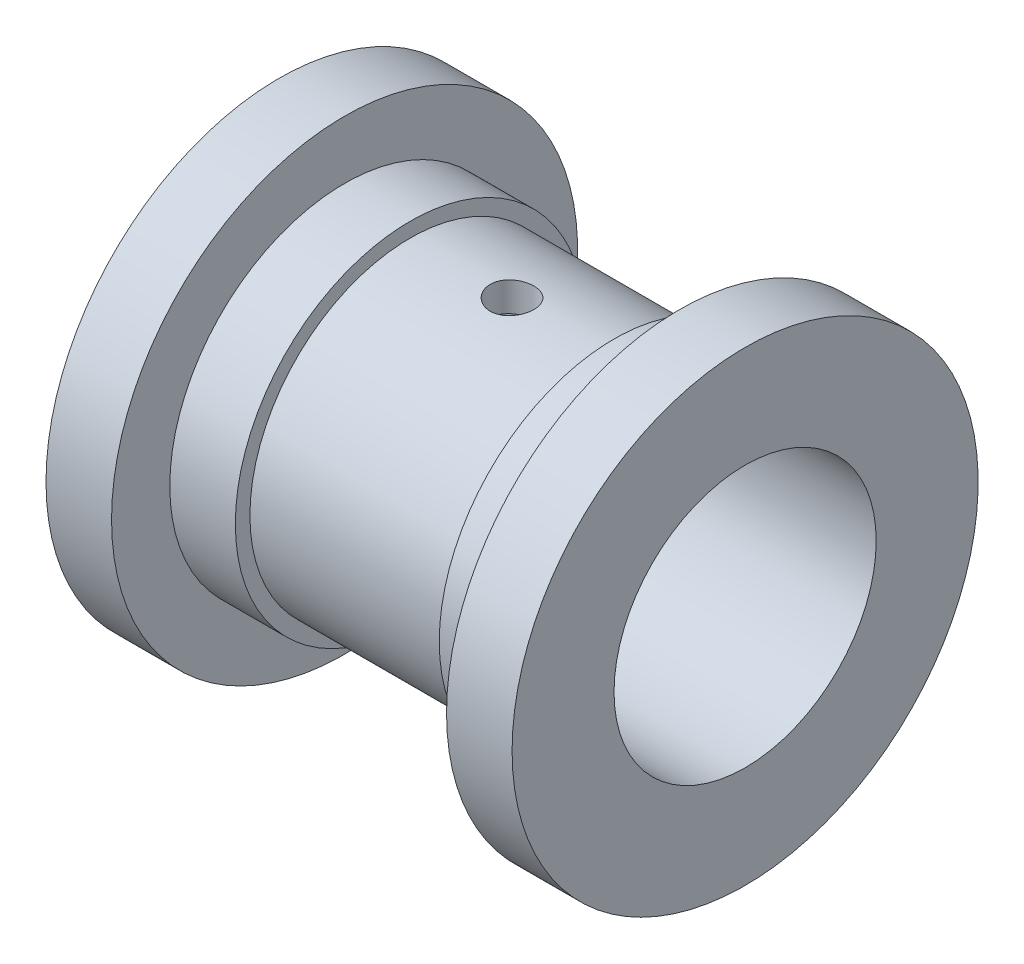
ISO-10303-21;
HEADER;
FILE_DESCRIPTION(('STEP AP214'),'2;1');
FILE_NAME('part.step','',(''),(''),'','','');
FILE_SCHEMA(('AUTOMOTIVE_DESIGN { 1 0 10303 214 1 1 1 1 }'));
ENDSEC;
DATA;
#1=APPLICATION_CONTEXT('core data for automotive mechanical design processes');
#2=APPLICATION_PROTOCOL_DEFINITION('international standard','automotive_design',2000,#1);
#3=PRODUCT_CONTEXT('',#1,'mechanical');
#4=PRODUCT('Part','Part','',(#3));
#5=PRODUCT_RELATED_PRODUCT_CATEGORY('part','',(#4));
#6=PRODUCT_DEFINITION_FORMATION('','',#4);
#7=PRODUCT_DEFINITION_CONTEXT('part definition',#1,'design');
#8=PRODUCT_DEFINITION('design','',#6,#7);
#9=PRODUCT_DEFINITION_SHAPE('','',#8);
#10=(LENGTH_UNIT() NAMED_UNIT(*) SI_UNIT(.MILLI.,.METRE.));
#11=(NAMED_UNIT(*) PLANE_ANGLE_UNIT() SI_UNIT($,.RADIAN.));
#12=(NAMED_UNIT(*) SI_UNIT($,.STERADIAN.) SOLID_ANGLE_UNIT());
#13=UNCERTAINTY_MEASURE_WITH_UNIT(LENGTH_MEASURE(1.E-05),#10,'distance_accuracy_value','');
#14=(GEOMETRIC_REPRESENTATION_CONTEXT(3) GLOBAL_UNCERTAINTY_ASSIGNED_CONTEXT((#13)) GLOBAL_UNIT_ASSIGNED_CONTEXT((#10,
#11,#12)) REPRESENTATION_CONTEXT('',''));
#15=CARTESIAN_POINT('',(0.,0.,0.));
#16=DIRECTION('',(0.,0.,1.));
#17=DIRECTION('',(1.,0.,0.));
#18=AXIS2_PLACEMENT_3D('',#15,#16,#17);
#19=CARTESIAN_POINT('',(-55.6977329974811,0.,0.));
#20=DIRECTION('',(-1.,0.,0.));
#21=DIRECTION('',(0.,0.,1.));
#22=AXIS2_PLACEMENT_3D('',#19,#20,#21);
#23=CYLINDRICAL_SURFACE('',#22,22.);
#24=CARTESIAN_POINT('',(0.,21.7944947177034,-3.));
#25=CARTESIAN_POINT('',(0.167668655793932,21.7944973125222,-2.99999295397829));
#26=CARTESIAN_POINT('',(0.335438885571998,21.7964504822141,-2.98589613516892));
#27=CARTESIAN_POINT('',(0.666300949403409,21.8040481680046,-2.92988930626152));
#28=CARTESIAN_POINT('',(0.829387860056514,21.8096964302678,-2.88795106929477));
#29=CARTESIAN_POINT('',(1.14604557101637,21.8240329226108,-2.77752885626791));
#30=CARTESIAN_POINT('',(1.29962310318679,21.8327189725423,-2.70906391400626));
#31=CARTESIAN_POINT('',(1.59308393749803,21.8521497354893,-2.54757436301586));
#32=CARTESIAN_POINT('',(1.73296937813151,21.8628941262462,-2.4545535979434));
#33=CARTESIAN_POINT('',(1.99602918996938,21.8853107439761,-2.24593261550096));
#34=CARTESIAN_POINT('',(2.11909952067151,21.8969880962733,-2.13020174404838));
#35=CARTESIAN_POINT('',(2.34413561137157,21.9199089625179,-1.87972745186893));
#36=CARTESIAN_POINT('',(2.44610027468495,21.9311524538967,-1.74498304377951));
#37=CARTESIAN_POINT('',(2.62640880979332,21.9519917823356,-1.45964673364285));
#38=CARTESIAN_POINT('',(2.70465775314384,21.9615809332171,-1.30899431491147));
#39=CARTESIAN_POINT('',(2.83470513621747,21.9779746087792,-0.996533559622196));
#40=CARTESIAN_POINT('',(2.88650473676131,21.9847792556648,-0.834725713012597));
#41=CARTESIAN_POINT('',(2.96187006393193,21.9948010960819,-0.505615027627407));
#42=CARTESIAN_POINT('',(2.98560939170287,21.9980403391051,-0.338352625202421));
#43=CARTESIAN_POINT('',(3.00471876192815,22.0006418160325,-0.00218901989865311));
#44=CARTESIAN_POINT('',(3.00009012009931,22.0000042297454,0.16671210661274));
#45=CARTESIAN_POINT('',(2.96273314482718,21.9949416293269,0.50017613409549));
#46=CARTESIAN_POINT('',(2.93019154096829,21.9905417842193,0.664760389901238));
#47=CARTESIAN_POINT('',(2.83822479796853,21.9784771616625,0.986109968659579));
#48=CARTESIAN_POINT('',(2.77879906739158,21.9708123123852,1.1428751195119));
#49=CARTESIAN_POINT('',(2.63455559502031,21.9530355245633,1.44470900216683));
#50=CARTESIAN_POINT('',(2.54965799841275,21.9429159096715,1.58973910165001));
#51=CARTESIAN_POINT('',(2.35693890109396,21.9213599095811,1.86356465940336));
#52=CARTESIAN_POINT('',(2.24911615051487,21.9099234526045,1.99235923191069));
#53=CARTESIAN_POINT('',(2.01256398815935,21.8869019715346,2.23115639122851));
#54=CARTESIAN_POINT('',(1.88367170498197,21.8753164955576,2.34099765683572));
#55=CARTESIAN_POINT('',(1.60919608132634,21.8533940433535,2.53751386076589));
#56=CARTESIAN_POINT('',(1.46361266894255,21.8430570725053,2.62418869928229));
#57=CARTESIAN_POINT('',(1.15973309839801,21.8248023099056,2.77192629130127));
#58=CARTESIAN_POINT('',(1.00142980323137,21.816885888441,2.83297454471217));
#59=CARTESIAN_POINT('',(0.67668593885512,21.8043941534575,2.92757469616753));
#60=CARTESIAN_POINT('',(0.510245840045062,21.799818647039,2.96112818173423));
#61=CARTESIAN_POINT('',(0.17538231298618,21.7945626889125,2.99956941672119));
#62=CARTESIAN_POINT('',(0.00698549676102019,21.7938512929769,3.00468490854897));
#63=CARTESIAN_POINT('',(-0.328262835866351,21.7963221316711,2.98670732293099));
#64=CARTESIAN_POINT('',(-0.49511439154408,21.7995042670648,2.96361496443094));
#65=CARTESIAN_POINT('',(-0.821843465157792,21.8093753071634,2.89006955453774));
#66=CARTESIAN_POINT('',(-0.981746585492375,21.8160498979624,2.83972815512375));
#67=CARTESIAN_POINT('',(-1.29084344925947,21.8321421092609,2.71322912313733));
#68=CARTESIAN_POINT('',(-1.44003674919157,21.8415598432741,2.63707042220062));
#69=CARTESIAN_POINT('',(-1.72450521244539,21.8621508077798,2.46054424209315));
#70=CARTESIAN_POINT('',(-1.85968743225274,21.8733346554527,2.36002824545062));
#71=CARTESIAN_POINT('',(-2.11134500486865,21.8961649833416,2.13784918546698));
#72=CARTESIAN_POINT('',(-2.22781948780176,21.9078114850387,2.01618513932771));
#73=CARTESIAN_POINT('',(-2.43956305361874,21.9303506440045,1.75416517490271));
#74=CARTESIAN_POINT('',(-2.53468192892496,21.9412376115705,1.61368731048535));
#75=CARTESIAN_POINT('',(-2.6999717780776,21.9609445601932,1.31861563564173));
#76=CARTESIAN_POINT('',(-2.77014333476205,21.9697645895377,1.1640221551012));
#77=CARTESIAN_POINT('',(-2.88330205185705,21.9843187797623,0.84559361706388));
#78=CARTESIAN_POINT('',(-2.92637398729285,21.9900625555324,0.681789143548596));
#79=CARTESIAN_POINT('',(-2.98438601535222,21.9978571930975,0.349189125621002));
#80=CARTESIAN_POINT('',(-2.99932763043927,21.9999082547485,0.180393851822024));
#81=CARTESIAN_POINT('',(-3.00062266554247,22.0000849669784,-0.155933944793779));
#82=CARTESIAN_POINT('',(-2.98720691376543,21.9982423123403,-0.323465608546993));
#83=CARTESIAN_POINT('',(-2.93265946872278,21.9909020074537,-0.653868527504439));
#84=CARTESIAN_POINT('',(-2.89152782222594,21.9854043633727,-0.816739790572315));
#85=CARTESIAN_POINT('',(-2.78279281440876,21.9713688879314,-1.13315387765859));
#86=CARTESIAN_POINT('',(-2.71520266767052,21.9628325744139,-1.28670131426867));
#87=CARTESIAN_POINT('',(-2.55549339551869,21.9436616719154,-1.58031159285156));
#88=CARTESIAN_POINT('',(-2.46337375671112,21.9330270390184,-1.72037415250691));
#89=CARTESIAN_POINT('',(-2.25637442655637,21.9107413064255,-1.98421472860386));
#90=CARTESIAN_POINT('',(-2.14132346408358,21.899082951343,-2.10785776937319));
#91=CARTESIAN_POINT('',(-1.89208624401361,21.8761200052605,-2.33416948478684));
#92=CARTESIAN_POINT('',(-1.75789548220963,21.864815498298,-2.43683320845295));
#93=CARTESIAN_POINT('',(-1.47347030664266,21.8437846234674,-2.61868613380124));
#94=CARTESIAN_POINT('',(-1.32316490840222,21.8340657568726,-2.69776514213643));
#95=CARTESIAN_POINT('',(-1.01135241536028,21.817394367016,-2.8294429199818));
#96=CARTESIAN_POINT('',(-0.84985747355831,21.8104388960614,-2.88206992162081));
#97=CARTESIAN_POINT('',(-0.57297720351398,21.8017355288375,-2.94703203226377));
#98=CARTESIAN_POINT('',(-0.459323577603181,21.7990341203125,-2.96686567785599));
#99=CARTESIAN_POINT('',(-0.230462622878617,21.7954128315745,-2.99335201931175));
#100=CARTESIAN_POINT('',(-0.115255309193854,21.7944929340268,-3.00000484343008));
#101=CARTESIAN_POINT('',(0.,21.7944947177034,-3.));
#102=B_SPLINE_CURVE_WITH_KNOTS('',3,(#24,#25,#26,#27,#28,#29,#30,#31,#32,#33,#34,#35,#36,#37,
#38,#39,#40,#41,#42,#43,#44,#45,#46,#47,#48,#49,#50,#51,#52,#53,#54,#55,#56,#57,#58,#59,#60,#61,
#62,#63,#64,#65,#66,#67,#68,#69,#70,#71,#72,#73,#74,#75,#76,#77,#78,#79,#80,#81,#82,#83,#84,#85,
#86,#87,#88,#89,#90,#91,#92,#93,#94,#95,#96,#97,#98,#99,#100,#101),.UNSPECIFIED.,.T.,.F.,(4,2,2,
2,2,2,2,2,2,2,2,2,2,2,2,2,2,2,2,2,2,2,2,2,2,2,2,2,2,2,2,2,2,2,2,2,2,2,4),(0.,0.502584827322537,
1.00567997726412,1.50841480614355,2.01107098991681,2.5167086035308,3.02237248429928,
3.53003447052541,4.03767417433728,4.54215653413514,5.04661549603351,5.54772586150296,
6.04884725166254,6.55155638132181,7.05429292546104,7.56111742626901,8.06794411056386,
8.57505718337533,9.08214097388763,9.58515792757104,10.0881620609109,10.5891205844915,
11.0900998411272,11.5942142584276,12.0983521093423,12.6059319233779,13.1134998781727,
13.6194720220333,14.125416780985,14.6272590296531,15.1291004314969,15.6306915099824,
16.1322930874247,16.6377918045005,17.1434096784681,17.6513541852326,18.158755407386,
18.5042352052812,18.8497116414995),.UNSPECIFIED.);
#103=CARTESIAN_POINT('',(0.,21.7944947177034,-3.));
#104=VERTEX_POINT('',#103);
#105=EDGE_CURVE('E93',#104,#104,#102,.T.);
#106=ORIENTED_EDGE('',*,*,#105,.T.);
#107=EDGE_LOOP('',(#106));
#108=FACE_BOUND('',#107,.T.);
#109=CARTESIAN_POINT('',(14.,0.,0.));
#110=DIRECTION('',(-1.,0.,0.));
#111=DIRECTION('',(0.,0.,1.));
#112=AXIS2_PLACEMENT_3D('',#109,#110,#111);
#113=CIRCLE('',#112,22.);
#114=CARTESIAN_POINT('',(14.,0.,22.));
#115=VERTEX_POINT('',#114);
#116=EDGE_CURVE('E71',#115,#115,#113,.T.);
#117=ORIENTED_EDGE('',*,*,#116,.T.);
#118=EDGE_LOOP('',(#117));
#119=FACE_BOUND('',#118,.T.);
#120=CARTESIAN_POINT('',(-14.,0.,0.));
#121=DIRECTION('',(-1.,0.,0.));
#122=DIRECTION('',(0.,0.,1.));
#123=AXIS2_PLACEMENT_3D('',#120,#121,#122);
#124=CIRCLE('',#123,22.);
#125=CARTESIAN_POINT('',(-14.,0.,22.));
#126=VERTEX_POINT('',#125);
#127=EDGE_CURVE('E68',#126,#126,#124,.T.);
#128=ORIENTED_EDGE('',*,*,#127,.F.);
#129=EDGE_LOOP('',(#128));
#130=FACE_BOUND('',#129,.T.);
#131=CARTESIAN_POINT('',(0.,-21.6333076527839,-4.));
#132=CARTESIAN_POINT('',(0.22268024514592,-21.6333118939645,-3.99999133497668));
#133=CARTESIAN_POINT('',(0.445474382576009,-21.636783172832,-3.98134200846101));
#134=CARTESIAN_POINT('',(0.884789231745938,-21.650277261808,-3.907282639324));
#135=CARTESIAN_POINT('',(1.10130431933857,-21.6603057667963,-3.85184064204138));
#136=CARTESIAN_POINT('',(1.52164062603702,-21.6857418061113,-3.70594738579437));
#137=CARTESIAN_POINT('',(1.7254731306161,-21.7011444752348,-3.61552778385547));
#138=CARTESIAN_POINT('',(2.11505978325792,-21.7355875966023,-3.40232850816631));
#139=CARTESIAN_POINT('',(2.30081551603275,-21.7546277295313,-3.27955167453961));
#140=CARTESIAN_POINT('',(2.65116689488351,-21.7944494758657,-3.00359049647932));
#141=CARTESIAN_POINT('',(2.8155201484679,-21.8152472612912,-2.85010070695621));
#142=CARTESIAN_POINT('',(3.11629112566885,-21.8560978635286,-2.51773079268323));
#143=CARTESIAN_POINT('',(3.25270706729076,-21.8761506327525,-2.338849049527));
#144=CARTESIAN_POINT('',(3.49465463690047,-21.9134244798488,-1.95918683799973));
#145=CARTESIAN_POINT('',(3.59995853999161,-21.930624292806,-1.75825898095977));
#146=CARTESIAN_POINT('',(3.77522666605229,-21.9600735467303,-1.34119954887522));
#147=CARTESIAN_POINT('',(3.84519362101874,-21.9723233703801,-1.12506915065336));
#148=CARTESIAN_POINT('',(3.94705446651091,-21.9903782117666,-0.686249675641717));
#149=CARTESIAN_POINT('',(3.97935662864144,-21.9962522909049,-0.463658257037537));
#150=CARTESIAN_POINT('',(4.0062423349248,-22.0011316177893,-0.0161429459318504));
#151=CARTESIAN_POINT('',(4.00082890714308,-22.0001374169679,0.208780757870075));
#152=CARTESIAN_POINT('',(3.95275171584416,-21.9914463710423,0.65177839228148));
#153=CARTESIAN_POINT('',(3.91052749297112,-21.9838286175382,0.869901800106698));
#154=CARTESIAN_POINT('',(3.79072160507699,-21.9628349381595,1.29591498120673));
#155=CARTESIAN_POINT('',(3.71313870922753,-21.949458811838,1.5038043979592));
#156=CARTESIAN_POINT('',(3.52439388044169,-21.9183184074471,1.90473245090769));
#157=CARTESIAN_POINT('',(3.41305471193233,-21.9005310604676,2.09768578503493));
#158=CARTESIAN_POINT('',(3.16008822015063,-21.8625379364344,2.46233526714585));
#159=CARTESIAN_POINT('',(3.01845799412901,-21.8423319276856,2.63402937539644));
#160=CARTESIAN_POINT('',(2.70650309084144,-21.8013981618568,2.95388890108789));
#161=CARTESIAN_POINT('',(2.53579396416203,-21.7806670830423,3.10167918809898));
#162=CARTESIAN_POINT('',(2.17181187215817,-21.7412992413716,3.36658543928332));
#163=CARTESIAN_POINT('',(1.97853861446948,-21.7226625056581,3.48370100593934));
#164=CARTESIAN_POINT('',(1.57443497902635,-21.6895894681967,3.68403076498185));
#165=CARTESIAN_POINT('',(1.36357833672043,-21.6751596002547,3.76719310770445));
#166=CARTESIAN_POINT('',(0.930565100223264,-21.6522346695387,3.89680753773996));
#167=CARTESIAN_POINT('',(0.708409706977714,-21.6437389774287,3.94326351793351));
#168=CARTESIAN_POINT('',(0.262480397589183,-21.6337680818549,3.99760435703092));
#169=CARTESIAN_POINT('',(0.0387741346607291,-21.6321950076555,4.00602696978329));
#170=CARTESIAN_POINT('',(-0.406849101122149,-21.6359859030778,3.98550109557699));
#171=CARTESIAN_POINT('',(-0.628766156427923,-21.6413495511773,3.95655434071577));
#172=CARTESIAN_POINT('',(-1.06276068810456,-21.6583185875735,3.86257219277794));
#173=CARTESIAN_POINT('',(-1.27490076801605,-21.6698756001577,3.79781637710752));
#174=CARTESIAN_POINT('',(-1.68531943765688,-21.6978878160151,3.63434995143755));
#175=CARTESIAN_POINT('',(-1.88359705817135,-21.7143433613546,3.53563697012216));
#176=CARTESIAN_POINT('',(-2.26303839203049,-21.7505226830533,3.30581172375987));
#177=CARTESIAN_POINT('',(-2.44399223616877,-21.7702800968595,3.17435835883133));
#178=CARTESIAN_POINT('',(-2.78146738319551,-21.8107413258404,2.88324609901472));
#179=CARTESIAN_POINT('',(-2.93798662399931,-21.8314452207,2.72358482602649));
#180=CARTESIAN_POINT('',(-3.22414569229957,-21.8717797209063,2.37819260014523));
#181=CARTESIAN_POINT('',(-3.3534247107236,-21.8913936565351,2.19216046504753));
#182=CARTESIAN_POINT('',(-3.57889261216599,-21.9270616275553,1.80070523958706));
#183=CARTESIAN_POINT('',(-3.67508271455434,-21.9431157941211,1.5952828641357));
#184=CARTESIAN_POINT('',(-3.83109607727288,-21.9697834526315,1.17189643669069));
#185=CARTESIAN_POINT('',(-3.89109980975306,-21.9804239020959,0.954000658707902));
#186=CARTESIAN_POINT('',(-3.97361468659431,-21.9951799495618,0.511013297926959));
#187=CARTESIAN_POINT('',(-3.99612953027341,-21.9992961913554,0.285922427358462));
#188=CARTESIAN_POINT('',(-4.00290504221103,-22.0005282842776,-0.161599238057634));
#189=CARTESIAN_POINT('',(-3.98771177696937,-21.9977440646224,-0.384021675850895));
#190=CARTESIAN_POINT('',(-3.92069410715213,-21.9856946780428,-0.823089077981733));
#191=CARTESIAN_POINT('',(-3.86887000960198,-21.9764295654387,-1.03973409072765));
#192=CARTESIAN_POINT('',(-3.73028619302147,-21.9524581381546,-1.46083086688086));
#193=CARTESIAN_POINT('',(-3.64358130924889,-21.9377603669599,-1.6653011932924));
#194=CARTESIAN_POINT('',(-3.43776119438248,-21.9045184478405,-2.05687402388434));
#195=CARTESIAN_POINT('',(-3.31864396744516,-21.8859740630709,-2.24397545759469));
#196=CARTESIAN_POINT('',(-3.04948472287622,-21.8467718041457,-2.59822919507097));
#197=CARTESIAN_POINT('',(-2.89904660923133,-21.826088758947,-2.76507779716897));
#198=CARTESIAN_POINT('',(-2.57234096661293,-21.7851034058444,-3.07135244710173));
#199=CARTESIAN_POINT('',(-2.39606738287678,-21.7648011884524,-3.21077204872679));
#200=CARTESIAN_POINT('',(-2.02088064879777,-21.7266856567864,-3.45935343607217));
#201=CARTESIAN_POINT('',(-1.8217855213773,-21.7088952940926,-3.56824417003713));
#202=CARTESIAN_POINT('',(-1.40787344654804,-21.6780923491353,-3.75086117813966));
#203=CARTESIAN_POINT('',(-1.19307181678437,-21.6650751844592,-3.82462119925559));
#204=CARTESIAN_POINT('',(-0.814646631135491,-21.6480562150115,-3.91959792411038));
#205=CARTESIAN_POINT('',(-0.653261474782771,-21.642557744208,-3.94969798379532));
#206=CARTESIAN_POINT('',(-0.327938095935636,-21.6351819455147,-3.98990196850047));
#207=CARTESIAN_POINT('',(-0.163999935860684,-21.6333045292318,-4.00000638163151));
#208=CARTESIAN_POINT('',(0.,-21.6333076527839,-4.));
#209=B_SPLINE_CURVE_WITH_KNOTS('',3,(#131,#132,#133,#134,#135,#136,#137,#138,#139,#140,#141,
#142,#143,#144,#145,#146,#147,#148,#149,#150,#151,#152,#153,#154,#155,#156,#157,#158,#159,#160,
#161,#162,#163,#164,#165,#166,#167,#168,#169,#170,#171,#172,#173,#174,#175,#176,#177,#178,#179,
#180,#181,#182,#183,#184,#185,#186,#187,#188,#189,#190,#191,#192,#193,#194,#195,#196,#197,#198,
#199,#200,#201,#202,#203,#204,#205,#206,#207,#208),.UNSPECIFIED.,.T.,.F.,(4,2,2,2,2,2,2,2,2,2,2,
2,2,2,2,2,2,2,2,2,2,2,2,2,2,2,2,2,2,2,2,2,2,2,2,2,2,2,4),(0.,0.667440705257541,1.33546184685072,
2.00287979476302,2.67023918023371,3.34459870230519,4.01900122532956,4.69822425023956,
5.3773947545028,6.04913278831927,6.7208168910346,7.38458890585933,8.04838402822076,
8.71572656975959,9.38313309046882,10.0601670169629,10.7372097167831,11.4152824897346,
12.0932833402558,12.7616672929396,13.4300202666519,14.0932273132435,14.7564806826868,
15.4269564046825,16.0974886789026,16.7764104513919,17.4553072020415,18.1307894735074,
18.8062050859725,19.4718969577386,20.1375832499996,20.8022270968082,21.4669118794232,
22.1405775941432,22.8144014413677,23.4940309659146,24.1730063069362,24.6645762030324,
25.1561340993393),.UNSPECIFIED.);
#210=CARTESIAN_POINT('',(0.,-21.6333076527839,-4.));
#211=VERTEX_POINT('',#210);
#212=EDGE_CURVE('E11',#211,#211,#209,.T.);
#213=ORIENTED_EDGE('',*,*,#212,.F.);
#214=EDGE_LOOP('',(#213));
#215=FACE_BOUND('',#214,.T.);
#216=ADVANCED_FACE('F37',(#108,#119,#130,#215),#23,.T.);
#217=CARTESIAN_POINT('',(-55.6977329974811,0.,0.));
#218=DIRECTION('',(-1.,0.,0.));
#219=DIRECTION('',(0.,0.,1.));
#220=AXIS2_PLACEMENT_3D('',#217,#218,#219);
#221=CYLINDRICAL_SURFACE('',#220,18.);
#222=CARTESIAN_POINT('',(0.,17.7482393492988,-3.));
#223=CARTESIAN_POINT('',(-0.167250897794174,17.7482423683992,-2.99999327810379));
#224=CARTESIAN_POINT('',(-0.334593127285767,17.7506291086228,-2.98596620283394));
#225=CARTESIAN_POINT('',(-0.664582251915803,17.7599094864005,-2.93025291367965));
#226=CARTESIAN_POINT('',(-0.827224672509678,17.7668072801564,-2.88854119237033));
#227=CARTESIAN_POINT('',(-1.14299074000993,17.7843073124077,-2.77875545240459));
#228=CARTESIAN_POINT('',(-1.2961222183947,17.7949064542081,-2.71070346591838));
#229=CARTESIAN_POINT('',(-1.58877714566133,17.8186112652274,-2.55022379626736));
#230=CARTESIAN_POINT('',(-1.7283021234928,17.8317166523307,-2.45779885620159));
#231=CARTESIAN_POINT('',(-1.99117541969348,17.8591016538706,-2.25022503235985));
#232=CARTESIAN_POINT('',(-2.11437015766346,17.8733906079353,-2.1348828587188));
#233=CARTESIAN_POINT('',(-2.33975196823417,17.901449768023,-1.88516640563433));
#234=CARTESIAN_POINT('',(-2.4419377957385,17.9152199432608,-1.75079099897997));
#235=CARTESIAN_POINT('',(-2.62297748066313,17.9407888437925,-1.46582744393803));
#236=CARTESIAN_POINT('',(-2.70168840927817,17.9525753091881,-1.31514729774805));
#237=CARTESIAN_POINT('',(-2.83262528463667,17.9727448434851,-1.00247474606864));
#238=CARTESIAN_POINT('',(-2.88485295346185,17.9811281336719,-0.840483076893824));
#239=CARTESIAN_POINT('',(-2.96087104198068,17.9934808166928,-0.511372471613089));
#240=CARTESIAN_POINT('',(-2.98491949920563,17.9974902373309,-0.344314664015124));
#241=CARTESIAN_POINT('',(-3.00469890498312,18.0007809521133,-0.00849034263095485));
#242=CARTESIAN_POINT('',(-3.00043177829668,18.0000625676317,0.16027605423468));
#243=CARTESIAN_POINT('',(-2.96390237816615,17.9940103011767,0.492962622094653));
#244=CARTESIAN_POINT('',(-2.93191780390902,17.9887222043088,0.65691423684017));
#245=CARTESIAN_POINT('',(-2.84129871090421,17.9741757452596,0.977090375534151));
#246=CARTESIAN_POINT('',(-2.7826633804926,17.9649172621585,1.13331466398181));
#247=CARTESIAN_POINT('',(-2.64013123162162,17.9433923821435,1.43442737733918));
#248=CARTESIAN_POINT('',(-2.55611998550107,17.9311124079226,1.57926062762286));
#249=CARTESIAN_POINT('',(-2.36530461283794,17.904908856858,1.85287863581597));
#250=CARTESIAN_POINT('',(-2.25849864154702,17.8909851470296,1.98166209349905));
#251=CARTESIAN_POINT('',(-2.02358543205683,17.8628432187912,2.221165528136));
#252=CARTESIAN_POINT('',(-1.89523548611882,17.8486234767725,2.33164740270385));
#253=CARTESIAN_POINT('',(-1.62169549174102,17.8216555174177,2.52954550613768));
#254=CARTESIAN_POINT('',(-1.47650528798062,17.8089073136559,2.6169615222389));
#255=CARTESIAN_POINT('',(-1.17313002974702,17.7863250547418,2.76629332138594));
#256=CARTESIAN_POINT('',(-1.01493060228949,17.7764942796312,2.82818043273509));
#257=CARTESIAN_POINT('',(-0.690181113230946,17.7609142642785,2.92443584497874));
#258=CARTESIAN_POINT('',(-0.52363178828109,17.7551646646599,2.95880656892155));
#259=CARTESIAN_POINT('',(-0.189040612605441,17.7484675130654,2.99871826185512));
#260=CARTESIAN_POINT('',(-0.0210403443574763,17.747463429104,3.00459864949493));
#261=CARTESIAN_POINT('',(0.313544006028985,17.7502204173883,2.98826724321895));
#262=CARTESIAN_POINT('',(0.480128142616768,17.7539813055822,2.9660565343496));
#263=CARTESIAN_POINT('',(0.806073311029031,17.7657922494602,2.89446280191372));
#264=CARTESIAN_POINT('',(0.965473367853614,17.7738150230202,2.84525254877566));
#265=CARTESIAN_POINT('',(1.27376419953538,17.793222876066,2.72123782823073));
#266=CARTESIAN_POINT('',(1.42265434506108,17.8046081566869,2.64643182972112));
#267=CARTESIAN_POINT('',(1.70720951328733,17.8295895407687,2.47254800787507));
#268=CARTESIAN_POINT('',(1.84273988730727,17.8432050672042,2.37325267699123));
#269=CARTESIAN_POINT('',(2.09533623923401,17.8710560001584,2.15350735884958));
#270=CARTESIAN_POINT('',(2.21240091733169,17.885291450224,2.03305588366085));
#271=CARTESIAN_POINT('',(2.42598227127445,17.9129570654192,1.77291368439457));
#272=CARTESIAN_POINT('',(2.52227259154145,17.9263773161361,1.63303590406343));
#273=CARTESIAN_POINT('',(2.68998639240586,17.9507413491953,1.33889213753919));
#274=CARTESIAN_POINT('',(2.76141067736862,17.9616852116397,1.18462661696475));
#275=CARTESIAN_POINT('',(2.87701270074584,17.979820298035,0.866758861801592));
#276=CARTESIAN_POINT('',(2.92130889088191,17.9870278148114,0.703200675123132));
#277=CARTESIAN_POINT('',(2.9817787187566,17.9969469980314,0.370836881849051));
#278=CARTESIAN_POINT('',(2.99795467047882,17.9996590344023,0.202031708185942));
#279=CARTESIAN_POINT('',(3.00165825877464,18.0002764546537,-0.133849530928414));
#280=CARTESIAN_POINT('',(2.9895303047293,17.9982396242903,-0.3009217927232));
#281=CARTESIAN_POINT('',(2.93771529327669,17.989706140648,-0.630614369177648));
#282=CARTESIAN_POINT('',(2.8980283901884,17.9832095123422,-0.793234708760977));
#283=CARTESIAN_POINT('',(2.79235420134762,17.9664838659288,-1.10927573510225));
#284=CARTESIAN_POINT('',(2.72639619814794,17.9562590044905,-1.26270644658459));
#285=CARTESIAN_POINT('',(2.5700904765233,17.9331930825364,-1.5563765435786));
#286=CARTESIAN_POINT('',(2.47974160192506,17.920351898009,-1.69661530334187));
#287=CARTESIAN_POINT('',(2.2759978890474,17.8932915553969,-1.96165553463168));
#288=CARTESIAN_POINT('',(2.16235085429849,17.8790582944934,-2.0862617167233));
#289=CARTESIAN_POINT('',(1.91576603051542,17.8509156397724,-2.31475665114109));
#290=CARTESIAN_POINT('',(1.78282372930496,17.8370063225941,-2.41864054405428));
#291=CARTESIAN_POINT('',(1.50030561301246,17.8109801224069,-2.60341712509304));
#292=CARTESIAN_POINT('',(1.35061879228142,17.7988766141494,-2.68414198686924));
#293=CARTESIAN_POINT('',(1.03966891699422,17.7779905210958,-2.81917744368513));
#294=CARTESIAN_POINT('',(0.878417612787161,17.7692046206985,-2.87351442626769));
#295=CARTESIAN_POINT('',(0.597115476615137,17.7578969382779,-2.94243126375291));
#296=CARTESIAN_POINT('',(0.478767830444869,17.7542954810336,-2.96398490120567));
#297=CARTESIAN_POINT('',(0.240295818195673,17.7494656234569,-2.99277155421758));
#298=CARTESIAN_POINT('',(0.120171484410961,17.7482371800443,-3.00000482975133));
#299=CARTESIAN_POINT('',(0.,17.7482393492988,-3.));
#300=B_SPLINE_CURVE_WITH_KNOTS('',3,(#222,#223,#224,#225,#226,#227,#228,#229,#230,#231,#232,
#233,#234,#235,#236,#237,#238,#239,#240,#241,#242,#243,#244,#245,#246,#247,#248,#249,#250,#251,
#252,#253,#254,#255,#256,#257,#258,#259,#260,#261,#262,#263,#264,#265,#266,#267,#268,#269,#270,
#271,#272,#273,#274,#275,#276,#277,#278,#279,#280,#281,#282,#283,#284,#285,#286,#287,#288,#289,
#290,#291,#292,#293,#294,#295,#296,#297,#298,#299),.UNSPECIFIED.,.T.,.F.,(4,2,2,2,2,2,2,2,2,2,2,
2,2,2,2,2,2,2,2,2,2,2,2,2,2,2,2,2,2,2,2,2,2,2,2,2,2,2,4),(0.,0.501313246713289,1.00308902395556,
1.50444599745023,2.00574656886329,2.51146990986858,3.01722321401337,3.52599576133722,
4.03473522133336,4.53877880967079,5.04278813583231,5.54180545397602,6.0408379709944,
6.54215524967311,7.04351311472117,7.55095348154548,8.05839852895223,8.56641194998325,
9.07438063125693,9.57628250904493,10.0781650009677,10.5768727756259,11.0756103875229,
11.5789481131524,12.0823212531683,12.5909293564246,13.0995210057204,13.6058758130118,
14.1121889509482,14.612373315191,15.1125548786259,15.6121804779895,16.111829764708,
16.617203969559,17.1226965465818,17.6317647314199,18.1403228009335,18.5005280465252,
18.8607267528218),.UNSPECIFIED.);
#301=CARTESIAN_POINT('',(0.,17.7482393492988,-3.));
#302=VERTEX_POINT('',#301);
#303=EDGE_CURVE('E101',#302,#302,#300,.T.);
#304=ORIENTED_EDGE('',*,*,#303,.T.);
#305=EDGE_LOOP('',(#304));
#306=FACE_BOUND('',#305,.T.);
#307=CARTESIAN_POINT('',(0.,-17.7482393492988,-3.));
#308=CARTESIAN_POINT('',(0.167250897794174,-17.7482423683992,-2.99999327810379));
#309=CARTESIAN_POINT('',(0.334593127285767,-17.7506291086228,-2.98596620283394));
#310=CARTESIAN_POINT('',(0.664582251915803,-17.7599094864005,-2.93025291367965));
#311=CARTESIAN_POINT('',(0.827224672509678,-17.7668072801564,-2.88854119237033));
#312=CARTESIAN_POINT('',(1.14299074000993,-17.7843073124077,-2.77875545240459));
#313=CARTESIAN_POINT('',(1.2961222183947,-17.7949064542081,-2.71070346591838));
#314=CARTESIAN_POINT('',(1.58877714566133,-17.8186112652274,-2.55022379626736));
#315=CARTESIAN_POINT('',(1.7283021234928,-17.8317166523307,-2.45779885620159));
#316=CARTESIAN_POINT('',(1.99117541969348,-17.8591016538706,-2.25022503235985));
#317=CARTESIAN_POINT('',(2.11437015766346,-17.8733906079353,-2.1348828587188));
#318=CARTESIAN_POINT('',(2.33975196823417,-17.901449768023,-1.88516640563433));
#319=CARTESIAN_POINT('',(2.4419377957385,-17.9152199432608,-1.75079099897997));
#320=CARTESIAN_POINT('',(2.62297748066313,-17.9407888437925,-1.46582744393803));
#321=CARTESIAN_POINT('',(2.70168840927817,-17.9525753091881,-1.31514729774805));
#322=CARTESIAN_POINT('',(2.83262528463667,-17.9727448434851,-1.00247474606864));
#323=CARTESIAN_POINT('',(2.88485295346185,-17.9811281336719,-0.840483076893824));
#324=CARTESIAN_POINT('',(2.96087104198068,-17.9934808166928,-0.511372471613089));
#325=CARTESIAN_POINT('',(2.98491949920563,-17.9974902373309,-0.344314664015124));
#326=CARTESIAN_POINT('',(3.00469890498312,-18.0007809521133,-0.00849034263095485));
#327=CARTESIAN_POINT('',(3.00043177829668,-18.0000625676317,0.16027605423468));
#328=CARTESIAN_POINT('',(2.96390237816615,-17.9940103011767,0.492962622094653));
#329=CARTESIAN_POINT('',(2.93191780390902,-17.9887222043088,0.65691423684017));
#330=CARTESIAN_POINT('',(2.84129871090421,-17.9741757452596,0.977090375534151));
#331=CARTESIAN_POINT('',(2.7826633804926,-17.9649172621585,1.13331466398181));
#332=CARTESIAN_POINT('',(2.64013123162162,-17.9433923821435,1.43442737733918));
#333=CARTESIAN_POINT('',(2.55611998550107,-17.9311124079226,1.57926062762286));
#334=CARTESIAN_POINT('',(2.36530461283794,-17.904908856858,1.85287863581597));
#335=CARTESIAN_POINT('',(2.25849864154702,-17.8909851470296,1.98166209349905));
#336=CARTESIAN_POINT('',(2.02358543205683,-17.8628432187912,2.221165528136));
#337=CARTESIAN_POINT('',(1.89523548611882,-17.8486234767725,2.33164740270385));
#338=CARTESIAN_POINT('',(1.62169549174102,-17.8216555174177,2.52954550613768));
#339=CARTESIAN_POINT('',(1.47650528798062,-17.8089073136559,2.6169615222389));
#340=CARTESIAN_POINT('',(1.17313002974702,-17.7863250547418,2.76629332138594));
#341=CARTESIAN_POINT('',(1.01493060228949,-17.7764942796312,2.82818043273509));
#342=CARTESIAN_POINT('',(0.690181113230946,-17.7609142642785,2.92443584497874));
#343=CARTESIAN_POINT('',(0.52363178828109,-17.7551646646599,2.95880656892155));
#344=CARTESIAN_POINT('',(0.189040612605441,-17.7484675130654,2.99871826185512));
#345=CARTESIAN_POINT('',(0.0210403443574763,-17.747463429104,3.00459864949493));
#346=CARTESIAN_POINT('',(-0.313544006028985,-17.7502204173883,2.98826724321895));
#347=CARTESIAN_POINT('',(-0.480128142616768,-17.7539813055822,2.9660565343496));
#348=CARTESIAN_POINT('',(-0.806073311029031,-17.7657922494602,2.89446280191372));
#349=CARTESIAN_POINT('',(-0.965473367853614,-17.7738150230202,2.84525254877566));
#350=CARTESIAN_POINT('',(-1.27376419953538,-17.793222876066,2.72123782823073));
#351=CARTESIAN_POINT('',(-1.42265434506108,-17.8046081566869,2.64643182972112));
#352=CARTESIAN_POINT('',(-1.70720951328733,-17.8295895407687,2.47254800787507));
#353=CARTESIAN_POINT('',(-1.84273988730727,-17.8432050672042,2.37325267699123));
#354=CARTESIAN_POINT('',(-2.09533623923401,-17.8710560001584,2.15350735884958));
#355=CARTESIAN_POINT('',(-2.21240091733169,-17.885291450224,2.03305588366085));
#356=CARTESIAN_POINT('',(-2.42598227127445,-17.9129570654192,1.77291368439457));
#357=CARTESIAN_POINT('',(-2.52227259154145,-17.9263773161361,1.63303590406343));
#358=CARTESIAN_POINT('',(-2.68998639240586,-17.9507413491953,1.33889213753919));
#359=CARTESIAN_POINT('',(-2.76141067736862,-17.9616852116397,1.18462661696475));
#360=CARTESIAN_POINT('',(-2.87701270074584,-17.979820298035,0.866758861801592));
#361=CARTESIAN_POINT('',(-2.92130889088191,-17.9870278148114,0.703200675123132));
#362=CARTESIAN_POINT('',(-2.9817787187566,-17.9969469980314,0.370836881849051));
#363=CARTESIAN_POINT('',(-2.99795467047882,-17.9996590344023,0.202031708185942));
#364=CARTESIAN_POINT('',(-3.00165825877464,-18.0002764546537,-0.133849530928414));
#365=CARTESIAN_POINT('',(-2.9895303047293,-17.9982396242903,-0.3009217927232));
#366=CARTESIAN_POINT('',(-2.93771529327669,-17.989706140648,-0.630614369177648));
#367=CARTESIAN_POINT('',(-2.8980283901884,-17.9832095123422,-0.793234708760977));
#368=CARTESIAN_POINT('',(-2.79235420134762,-17.9664838659288,-1.10927573510225));
#369=CARTESIAN_POINT('',(-2.72639619814794,-17.9562590044905,-1.26270644658459));
#370=CARTESIAN_POINT('',(-2.5700904765233,-17.9331930825364,-1.5563765435786));
#371=CARTESIAN_POINT('',(-2.47974160192506,-17.920351898009,-1.69661530334187));
#372=CARTESIAN_POINT('',(-2.2759978890474,-17.8932915553969,-1.96165553463168));
#373=CARTESIAN_POINT('',(-2.16235085429849,-17.8790582944934,-2.0862617167233));
#374=CARTESIAN_POINT('',(-1.91576603051542,-17.8509156397724,-2.31475665114109));
#375=CARTESIAN_POINT('',(-1.78282372930496,-17.8370063225941,-2.41864054405428));
#376=CARTESIAN_POINT('',(-1.50030561301246,-17.8109801224069,-2.60341712509304));
#377=CARTESIAN_POINT('',(-1.35061879228142,-17.7988766141494,-2.68414198686924));
#378=CARTESIAN_POINT('',(-1.03966891699422,-17.7779905210958,-2.81917744368513));
#379=CARTESIAN_POINT('',(-0.878417612787161,-17.7692046206985,-2.87351442626769));
#380=CARTESIAN_POINT('',(-0.597115476615137,-17.7578969382779,-2.94243126375291));
#381=CARTESIAN_POINT('',(-0.478767830444869,-17.7542954810336,-2.96398490120567));
#382=CARTESIAN_POINT('',(-0.240295818195673,-17.7494656234569,-2.99277155421758));
#383=CARTESIAN_POINT('',(-0.120171484410961,-17.7482371800443,-3.00000482975133));
#384=CARTESIAN_POINT('',(0.,-17.7482393492988,-3.));
#385=B_SPLINE_CURVE_WITH_KNOTS('',3,(#307,#308,#309,#310,#311,#312,#313,#314,#315,#316,#317,
#318,#319,#320,#321,#322,#323,#324,#325,#326,#327,#328,#329,#330,#331,#332,#333,#334,#335,#336,
#337,#338,#339,#340,#341,#342,#343,#344,#345,#346,#347,#348,#349,#350,#351,#352,#353,#354,#355,
#356,#357,#358,#359,#360,#361,#362,#363,#364,#365,#366,#367,#368,#369,#370,#371,#372,#373,#374,
#375,#376,#377,#378,#379,#380,#381,#382,#383,#384),.UNSPECIFIED.,.T.,.F.,(4,2,2,2,2,2,2,2,2,2,2,
2,2,2,2,2,2,2,2,2,2,2,2,2,2,2,2,2,2,2,2,2,2,2,2,2,2,2,4),(0.,0.501313246713289,1.00308902395556,
1.50444599745023,2.00574656886329,2.51146990986858,3.01722321401337,3.52599576133722,
4.03473522133336,4.53877880967079,5.04278813583231,5.54180545397602,6.0408379709944,
6.54215524967311,7.04351311472117,7.55095348154548,8.05839852895223,8.56641194998325,
9.07438063125693,9.57628250904493,10.0781650009677,10.5768727756259,11.0756103875229,
11.5789481131524,12.0823212531683,12.5909293564246,13.0995210057204,13.6058758130118,
14.1121889509482,14.612373315191,15.1125548786259,15.6121804779895,16.111829764708,
16.617203969559,17.1226965465818,17.6317647314199,18.1403228009335,18.5005280465252,
18.8607267528218),.UNSPECIFIED.);
#386=CARTESIAN_POINT('',(0.,-17.7482393492988,-3.));
#387=VERTEX_POINT('',#386);
#388=EDGE_CURVE('E118',#387,#387,#385,.T.);
#389=ORIENTED_EDGE('',*,*,#388,.T.);
#390=EDGE_LOOP('',(#389));
#391=FACE_BOUND('',#390,.T.);
#392=CARTESIAN_POINT('',(32.,0.,0.));
#393=DIRECTION('',(-1.,0.,0.));
#394=DIRECTION('',(0.,0.,1.));
#395=AXIS2_PLACEMENT_3D('',#392,#393,#394);
#396=CIRCLE('',#395,18.);
#397=CARTESIAN_POINT('',(32.,0.,18.));
#398=VERTEX_POINT('',#397);
#399=EDGE_CURVE('E86',#398,#398,#396,.T.);
#400=ORIENTED_EDGE('',*,*,#399,.F.);
#401=EDGE_LOOP('',(#400));
#402=FACE_BOUND('',#401,.T.);
#403=CARTESIAN_POINT('',(-32.,0.,0.));
#404=DIRECTION('',(-1.,0.,0.));
#405=DIRECTION('',(0.,0.,1.));
#406=AXIS2_PLACEMENT_3D('',#403,#404,#405);
#407=CIRCLE('',#406,18.);
#408=CARTESIAN_POINT('',(-32.,0.,18.));
#409=VERTEX_POINT('',#408);
#410=EDGE_CURVE('E49',#409,#409,#407,.T.);
#411=ORIENTED_EDGE('',*,*,#410,.T.);
#412=EDGE_LOOP('',(#411));
#413=FACE_BOUND('',#412,.T.);
#414=ADVANCED_FACE('F39',(#306,#391,#402,#413),#221,.F.);
#415=CARTESIAN_POINT('',(-32.,18.,0.));
#416=DIRECTION('',(1.,0.,0.));
#417=DIRECTION('',(0.,0.,-1.));
#418=AXIS2_PLACEMENT_3D('',#415,#416,#417);
#419=PLANE('',#418);
#420=ORIENTED_EDGE('',*,*,#410,.F.);
#421=EDGE_LOOP('',(#420));
#422=FACE_BOUND('',#421,.T.);
#423=CARTESIAN_POINT('',(-32.,0.,0.));
#424=DIRECTION('',(-1.,0.,0.));
#425=DIRECTION('',(0.,0.,1.));
#426=AXIS2_PLACEMENT_3D('',#423,#424,#425);
#427=CIRCLE('',#426,32.);
#428=CARTESIAN_POINT('',(-32.,0.,32.));
#429=VERTEX_POINT('',#428);
#430=EDGE_CURVE('E53',#429,#429,#427,.T.);
#431=ORIENTED_EDGE('',*,*,#430,.T.);
#432=EDGE_LOOP('',(#431));
#433=FACE_BOUND('',#432,.T.);
#434=ADVANCED_FACE('F158',(#422,#433),#419,.F.);
#435=CARTESIAN_POINT('',(-55.6977329974811,0.,0.));
#436=DIRECTION('',(-1.,0.,0.));
#437=DIRECTION('',(0.,0.,1.));
#438=AXIS2_PLACEMENT_3D('',#435,#436,#437);
#439=CYLINDRICAL_SURFACE('',#438,32.);
#440=ORIENTED_EDGE('',*,*,#430,.F.);
#441=EDGE_LOOP('',(#440));
#442=FACE_BOUND('',#441,.T.);
#443=CARTESIAN_POINT('',(-23.,0.,0.));
#444=DIRECTION('',(-1.,0.,0.));
#445=DIRECTION('',(0.,0.,1.));
#446=AXIS2_PLACEMENT_3D('',#443,#444,#445);
#447=CIRCLE('',#446,32.);
#448=CARTESIAN_POINT('',(-23.,0.,32.));
#449=VERTEX_POINT('',#448);
#450=EDGE_CURVE('E57',#449,#449,#447,.T.);
#451=ORIENTED_EDGE('',*,*,#450,.T.);
#452=EDGE_LOOP('',(#451));
#453=FACE_BOUND('',#452,.T.);
#454=ADVANCED_FACE('F155',(#442,#453),#439,.T.);
#455=CARTESIAN_POINT('',(-23.,32.,0.));
#456=DIRECTION('',(-1.,0.,0.));
#457=DIRECTION('',(0.,0.,1.));
#458=AXIS2_PLACEMENT_3D('',#455,#456,#457);
#459=PLANE('',#458);
#460=ORIENTED_EDGE('',*,*,#450,.F.);
#461=EDGE_LOOP('',(#460));
#462=FACE_BOUND('',#461,.T.);
#463=CARTESIAN_POINT('',(-23.,0.,0.));
#464=DIRECTION('',(-1.,0.,0.));
#465=DIRECTION('',(0.,0.,1.));
#466=AXIS2_PLACEMENT_3D('',#463,#464,#465);
#467=CIRCLE('',#466,24.);
#468=CARTESIAN_POINT('',(-23.,0.,24.));
#469=VERTEX_POINT('',#468);
#470=EDGE_CURVE('E62',#469,#469,#467,.T.);
#471=ORIENTED_EDGE('',*,*,#470,.T.);
#472=EDGE_LOOP('',(#471));
#473=FACE_BOUND('',#472,.T.);
#474=ADVANCED_FACE('F148',(#462,#473),#459,.F.);
#475=CARTESIAN_POINT('',(-55.6977329974811,0.,0.));
#476=DIRECTION('',(-1.,0.,0.));
#477=DIRECTION('',(0.,0.,1.));
#478=AXIS2_PLACEMENT_3D('',#475,#476,#477);
#479=CYLINDRICAL_SURFACE('',#478,24.);
#480=ORIENTED_EDGE('',*,*,#470,.F.);
#481=EDGE_LOOP('',(#480));
#482=FACE_BOUND('',#481,.T.);
#483=CARTESIAN_POINT('',(-14.,0.,0.));
#484=DIRECTION('',(-1.,0.,0.));
#485=DIRECTION('',(0.,0.,1.));
#486=AXIS2_PLACEMENT_3D('',#483,#484,#485);
#487=CIRCLE('',#486,24.);
#488=CARTESIAN_POINT('',(-14.,0.,24.));
#489=VERTEX_POINT('',#488);
#490=EDGE_CURVE('E65',#489,#489,#487,.T.);
#491=ORIENTED_EDGE('',*,*,#490,.T.);
#492=EDGE_LOOP('',(#491));
#493=FACE_BOUND('',#492,.T.);
#494=ADVANCED_FACE('F140',(#482,#493),#479,.T.);
#495=CARTESIAN_POINT('',(-14.,24.,0.));
#496=DIRECTION('',(-1.,0.,0.));
#497=DIRECTION('',(0.,0.,1.));
#498=AXIS2_PLACEMENT_3D('',#495,#496,#497);
#499=PLANE('',#498);
#500=ORIENTED_EDGE('',*,*,#490,.F.);
#501=EDGE_LOOP('',(#500));
#502=FACE_BOUND('',#501,.T.);
#503=ORIENTED_EDGE('',*,*,#127,.T.);
#504=EDGE_LOOP('',(#503));
#505=FACE_BOUND('',#504,.T.);
#506=ADVANCED_FACE('F137',(#502,#505),#499,.F.);
#507=CARTESIAN_POINT('',(14.,22.,0.));
#508=DIRECTION('',(1.,0.,0.));
#509=DIRECTION('',(0.,0.,-1.));
#510=AXIS2_PLACEMENT_3D('',#507,#508,#509);
#511=PLANE('',#510);
#512=ORIENTED_EDGE('',*,*,#116,.F.);
#513=EDGE_LOOP('',(#512));
#514=FACE_BOUND('',#513,.T.);
#515=CARTESIAN_POINT('',(14.,0.,0.));
#516=DIRECTION('',(-1.,0.,0.));
#517=DIRECTION('',(0.,0.,1.));
#518=AXIS2_PLACEMENT_3D('',#515,#516,#517);
#519=CIRCLE('',#518,24.);
#520=CARTESIAN_POINT('',(14.,0.,24.));
#521=VERTEX_POINT('',#520);
#522=EDGE_CURVE('E74',#521,#521,#519,.T.);
#523=ORIENTED_EDGE('',*,*,#522,.T.);
#524=EDGE_LOOP('',(#523));
#525=FACE_BOUND('',#524,.T.);
#526=ADVANCED_FACE('F139',(#514,#525),#511,.F.);
#527=CARTESIAN_POINT('',(-55.6977329974811,0.,0.));
#528=DIRECTION('',(-1.,0.,0.));
#529=DIRECTION('',(0.,0.,1.));
#530=AXIS2_PLACEMENT_3D('',#527,#528,#529);
#531=CYLINDRICAL_SURFACE('',#530,24.);
#532=ORIENTED_EDGE('',*,*,#522,.F.);
#533=EDGE_LOOP('',(#532));
#534=FACE_BOUND('',#533,.T.);
#535=CARTESIAN_POINT('',(23.,0.,0.));
#536=DIRECTION('',(-1.,0.,0.));
#537=DIRECTION('',(0.,0.,1.));
#538=AXIS2_PLACEMENT_3D('',#535,#536,#537);
#539=CIRCLE('',#538,24.);
#540=CARTESIAN_POINT('',(23.,0.,24.));
#541=VERTEX_POINT('',#540);
#542=EDGE_CURVE('E77',#541,#541,#539,.T.);
#543=ORIENTED_EDGE('',*,*,#542,.T.);
#544=EDGE_LOOP('',(#543));
#545=FACE_BOUND('',#544,.T.);
#546=ADVANCED_FACE('F146',(#534,#545),#531,.T.);
#547=CARTESIAN_POINT('',(23.,24.,0.));
#548=DIRECTION('',(1.,0.,0.));
#549=DIRECTION('',(0.,0.,-1.));
#550=AXIS2_PLACEMENT_3D('',#547,#548,#549);
#551=PLANE('',#550);
#552=ORIENTED_EDGE('',*,*,#542,.F.);
#553=EDGE_LOOP('',(#552));
#554=FACE_BOUND('',#553,.T.);
#555=CARTESIAN_POINT('',(23.,0.,0.));
#556=DIRECTION('',(-1.,0.,0.));
#557=DIRECTION('',(0.,0.,1.));
#558=AXIS2_PLACEMENT_3D('',#555,#556,#557);
#559=CIRCLE('',#558,32.);
#560=CARTESIAN_POINT('',(23.,0.,32.));
#561=VERTEX_POINT('',#560);
#562=EDGE_CURVE('E80',#561,#561,#559,.T.);
#563=ORIENTED_EDGE('',*,*,#562,.T.);
#564=EDGE_LOOP('',(#563));
#565=FACE_BOUND('',#564,.T.);
#566=ADVANCED_FACE('F218',(#554,#565),#551,.F.);
#567=CARTESIAN_POINT('',(-55.6977329974811,0.,0.));
#568=DIRECTION('',(-1.,0.,0.));
#569=DIRECTION('',(0.,0.,1.));
#570=AXIS2_PLACEMENT_3D('',#567,#568,#569);
#571=CYLINDRICAL_SURFACE('',#570,32.);
#572=ORIENTED_EDGE('',*,*,#562,.F.);
#573=EDGE_LOOP('',(#572));
#574=FACE_BOUND('',#573,.T.);
#575=CARTESIAN_POINT('',(32.,0.,0.));
#576=DIRECTION('',(-1.,0.,0.));
#577=DIRECTION('',(0.,0.,1.));
#578=AXIS2_PLACEMENT_3D('',#575,#576,#577);
#579=CIRCLE('',#578,32.);
#580=CARTESIAN_POINT('',(32.,0.,32.));
#581=VERTEX_POINT('',#580);
#582=EDGE_CURVE('E83',#581,#581,#579,.T.);
#583=ORIENTED_EDGE('',*,*,#582,.T.);
#584=EDGE_LOOP('',(#583));
#585=FACE_BOUND('',#584,.T.);
#586=ADVANCED_FACE('F208',(#574,#585),#571,.T.);
#587=CARTESIAN_POINT('',(32.,32.,0.));
#588=DIRECTION('',(-1.,0.,0.));
#589=DIRECTION('',(0.,0.,1.));
#590=AXIS2_PLACEMENT_3D('',#587,#588,#589);
#591=PLANE('',#590);
#592=ORIENTED_EDGE('',*,*,#582,.F.);
#593=EDGE_LOOP('',(#592));
#594=FACE_BOUND('',#593,.T.);
#595=ORIENTED_EDGE('',*,*,#399,.T.);
#596=EDGE_LOOP('',(#595));
#597=FACE_BOUND('',#596,.T.);
#598=ADVANCED_FACE('F200',(#594,#597),#591,.F.);
#599=CARTESIAN_POINT('',(0.,-30.,0.));
#600=DIRECTION('',(0.,1.,0.));
#601=DIRECTION('',(0.,0.,1.));
#602=AXIS2_PLACEMENT_3D('',#599,#600,#601);
#603=PLANE('',#602);
#604=CARTESIAN_POINT('',(0.,-30.,0.));
#605=DIRECTION('',(0.,1.,0.));
#606=DIRECTION('',(0.,0.,1.));
#607=AXIS2_PLACEMENT_3D('',#604,#605,#606);
#608=CIRCLE('',#607,3.);
#609=CARTESIAN_POINT('',(0.,-30.,3.));
#610=VERTEX_POINT('',#609);
#611=EDGE_CURVE('E89',#610,#610,#608,.T.);
#612=ORIENTED_EDGE('',*,*,#611,.T.);
#613=EDGE_LOOP('',(#612));
#614=FACE_BOUND('',#613,.T.);
#615=CARTESIAN_POINT('',(0.,-30.,0.));
#616=DIRECTION('',(0.,1.,0.));
#617=DIRECTION('',(0.,0.,1.));
#618=AXIS2_PLACEMENT_3D('',#615,#616,#617);
#619=CIRCLE('',#618,4.);
#620=CARTESIAN_POINT('',(0.,-30.,4.));
#621=VERTEX_POINT('',#620);
#622=EDGE_CURVE('E90',#621,#621,#619,.T.);
#623=ORIENTED_EDGE('',*,*,#622,.F.);
#624=EDGE_LOOP('',(#623));
#625=FACE_BOUND('',#624,.T.);
#626=ADVANCED_FACE('F114',(#614,#625),#603,.F.);
#627=CARTESIAN_POINT('',(0.,500000.,0.));
#628=DIRECTION('',(0.,-1.,0.));
#629=DIRECTION('',(0.,0.,-1.));
#630=AXIS2_PLACEMENT_3D('',#627,#628,#629);
#631=CYLINDRICAL_SURFACE('',#630,4.);
#632=ORIENTED_EDGE('',*,*,#622,.T.);
#633=EDGE_LOOP('',(#632));
#634=FACE_BOUND('',#633,.T.);
#635=ORIENTED_EDGE('',*,*,#212,.T.);
#636=EDGE_LOOP('',(#635));
#637=FACE_BOUND('',#636,.T.);
#638=ADVANCED_FACE('F186',(#634,#637),#631,.T.);
#639=CARTESIAN_POINT('',(0.,500000.,0.));
#640=DIRECTION('',(0.,-1.,0.));
#641=DIRECTION('',(0.,0.,-1.));
#642=AXIS2_PLACEMENT_3D('',#639,#640,#641);
#643=CYLINDRICAL_SURFACE('',#642,3.);
#644=ORIENTED_EDGE('',*,*,#611,.F.);
#645=EDGE_LOOP('',(#644));
#646=FACE_BOUND('',#645,.T.);
#647=ORIENTED_EDGE('',*,*,#388,.F.);
#648=EDGE_LOOP('',(#647));
#649=FACE_BOUND('',#648,.T.);
#650=ADVANCED_FACE('F112',(#646,#649),#643,.F.);
#651=CARTESIAN_POINT('',(0.,32.,0.));
#652=DIRECTION('',(0.,-1.,0.));
#653=DIRECTION('',(0.,0.,-1.));
#654=AXIS2_PLACEMENT_3D('',#651,#652,#653);
#655=CYLINDRICAL_SURFACE('',#654,3.);
#656=ORIENTED_EDGE('',*,*,#303,.F.);
#657=EDGE_LOOP('',(#656));
#658=FACE_BOUND('',#657,.T.);
#659=ORIENTED_EDGE('',*,*,#105,.F.);
#660=EDGE_LOOP('',(#659));
#661=FACE_BOUND('',#660,.T.);
#662=ADVANCED_FACE('F108',(#658,#661),#655,.F.);
#663=CLOSED_SHELL('',(#216,#414,#434,#454,#474,#494,#506,#526,#546,#566,#586,#598,#626,#638,
#650,#662));
#664=MANIFOLD_SOLID_BREP('B2',#663);
#665=ADVANCED_BREP_SHAPE_REPRESENTATION('',(#18,#664),#14);
#666=SHAPE_DEFINITION_REPRESENTATION(#9,#665);
ENDSEC;
END-ISO-10303-21;
